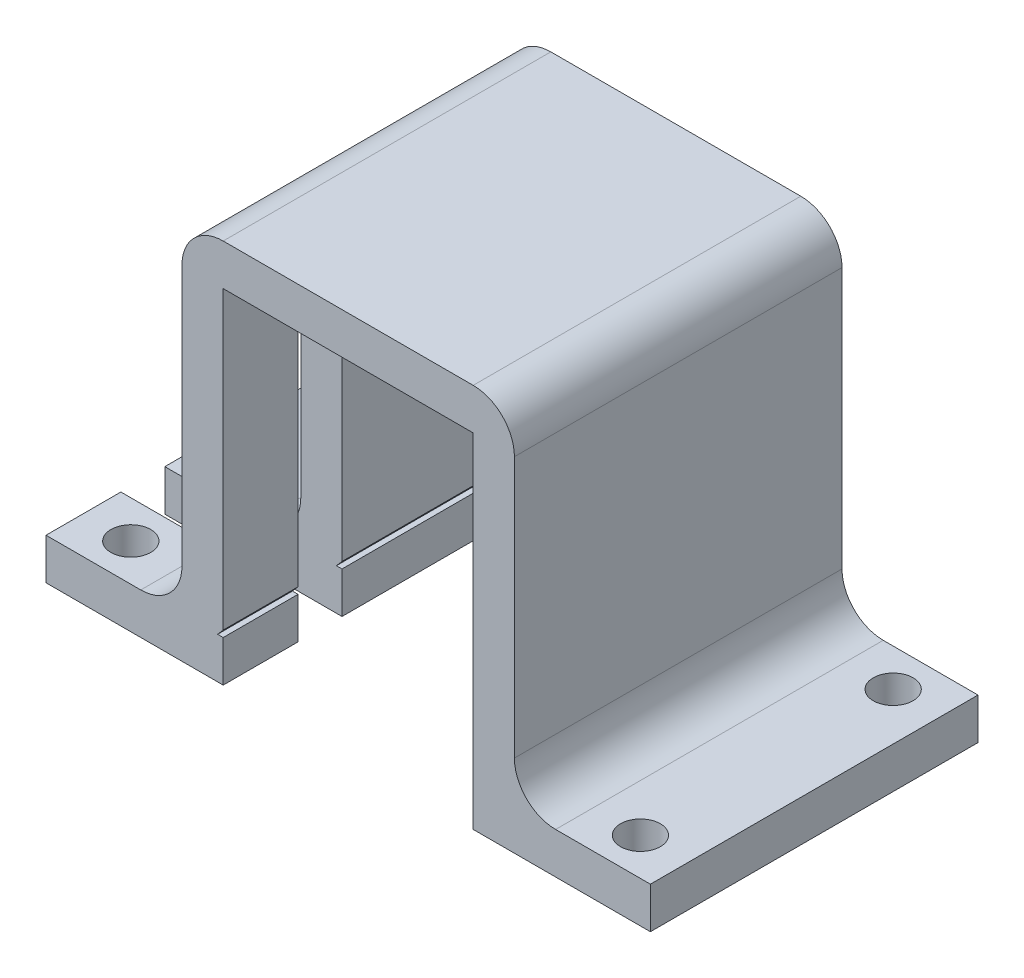
ISO-10303-21;
HEADER;
FILE_DESCRIPTION(('STEP AP214'),'2;1');
FILE_NAME('part.step','',(''),(''),'','','');
FILE_SCHEMA(('AUTOMOTIVE_DESIGN { 1 0 10303 214 1 1 1 1 }'));
ENDSEC;
DATA;
#1=APPLICATION_CONTEXT('core data for automotive mechanical design processes');
#2=APPLICATION_PROTOCOL_DEFINITION('international standard','automotive_design',2000,#1);
#3=PRODUCT_CONTEXT('',#1,'mechanical');
#4=PRODUCT('Part','Part','',(#3));
#5=PRODUCT_RELATED_PRODUCT_CATEGORY('part','',(#4));
#6=PRODUCT_DEFINITION_FORMATION('','',#4);
#7=PRODUCT_DEFINITION_CONTEXT('part definition',#1,'design');
#8=PRODUCT_DEFINITION('design','',#6,#7);
#9=PRODUCT_DEFINITION_SHAPE('','',#8);
#10=(LENGTH_UNIT() NAMED_UNIT(*) SI_UNIT(.MILLI.,.METRE.));
#11=(NAMED_UNIT(*) PLANE_ANGLE_UNIT() SI_UNIT($,.RADIAN.));
#12=(NAMED_UNIT(*) SI_UNIT($,.STERADIAN.) SOLID_ANGLE_UNIT());
#13=UNCERTAINTY_MEASURE_WITH_UNIT(LENGTH_MEASURE(1.E-05),#10,'distance_accuracy_value','');
#14=(GEOMETRIC_REPRESENTATION_CONTEXT(3) GLOBAL_UNCERTAINTY_ASSIGNED_CONTEXT((#13)) GLOBAL_UNIT_ASSIGNED_CONTEXT((#10,
#11,#12)) REPRESENTATION_CONTEXT('',''));
#15=CARTESIAN_POINT('',(0.,0.,0.));
#16=DIRECTION('',(0.,0.,1.));
#17=DIRECTION('',(1.,0.,0.));
#18=AXIS2_PLACEMENT_3D('',#15,#16,#17);
#19=CARTESIAN_POINT('',(0.,-11.,23.85));
#20=DIRECTION('',(0.,1.,0.));
#21=DIRECTION('',(-1.,0.,0.));
#22=AXIS2_PLACEMENT_3D('',#19,#20,#21);
#23=PLANE('',#22);
#24=DIRECTION('',(0.,0.,-1.));
#25=VECTOR('',#24,1.);
#26=CARTESIAN_POINT('',(-9.50714285714286,-11.,23.85));
#27=LINE('',#26,#25);
#28=CARTESIAN_POINT('',(-9.50714285714286,-11.,15.2));
#29=VERTEX_POINT('',#28);
#30=CARTESIAN_POINT('',(-9.50714285714286,-11.,0.));
#31=VERTEX_POINT('',#30);
#32=EDGE_CURVE('E369',#29,#31,#27,.T.);
#33=ORIENTED_EDGE('',*,*,#32,.F.);
#34=DIRECTION('',(1.,0.,0.));
#35=VECTOR('',#34,1.);
#36=CARTESIAN_POINT('',(0.,-11.,15.2));
#37=LINE('',#36,#35);
#38=CARTESIAN_POINT('',(-9.1,-11.,15.2));
#39=VERTEX_POINT('',#38);
#40=EDGE_CURVE('E435',#29,#39,#37,.T.);
#41=ORIENTED_EDGE('',*,*,#40,.T.);
#42=DIRECTION('',(0.,0.,-1.));
#43=VECTOR('',#42,1.);
#44=CARTESIAN_POINT('',(-9.1,-11.,23.85));
#45=LINE('',#44,#43);
#46=CARTESIAN_POINT('',(-9.1,-11.,0.));
#47=VERTEX_POINT('',#46);
#48=EDGE_CURVE('E140',#39,#47,#45,.T.);
#49=ORIENTED_EDGE('',*,*,#48,.T.);
#50=DIRECTION('',(1.,0.,0.));
#51=VECTOR('',#50,1.);
#52=CARTESIAN_POINT('',(0.,-11.,0.));
#53=LINE('',#52,#51);
#54=EDGE_CURVE('E236',#31,#47,#53,.T.);
#55=ORIENTED_EDGE('',*,*,#54,.F.);
#56=EDGE_LOOP('',(#33,#41,#49,#55));
#57=FACE_BOUND('',#56,.T.);
#58=ADVANCED_FACE('F47',(#57),#23,.T.);
#59=CARTESIAN_POINT('',(-9.1,-11.,23.85));
#60=VERTEX_POINT('',#59);
#61=CARTESIAN_POINT('',(-9.1,-11.,18.4));
#62=VERTEX_POINT('',#61);
#63=EDGE_CURVE('E72',#60,#62,#45,.T.);
#64=ORIENTED_EDGE('',*,*,#63,.T.);
#65=DIRECTION('',(-1.,0.,0.));
#66=VECTOR('',#65,1.);
#67=CARTESIAN_POINT('',(0.,-11.,18.4));
#68=LINE('',#67,#66);
#69=CARTESIAN_POINT('',(-9.50714285714286,-11.,18.4));
#70=VERTEX_POINT('',#69);
#71=EDGE_CURVE('E64',#62,#70,#68,.T.);
#72=ORIENTED_EDGE('',*,*,#71,.T.);
#73=CARTESIAN_POINT('',(-9.50714285714286,-11.,23.85));
#74=VERTEX_POINT('',#73);
#75=EDGE_CURVE('E147',#74,#70,#27,.T.);
#76=ORIENTED_EDGE('',*,*,#75,.F.);
#77=DIRECTION('',(1.,0.,0.));
#78=VECTOR('',#77,1.);
#79=CARTESIAN_POINT('',(0.,-11.,23.85));
#80=LINE('',#79,#78);
#81=EDGE_CURVE('E309',#74,#60,#80,.T.);
#82=ORIENTED_EDGE('',*,*,#81,.T.);
#83=EDGE_LOOP('',(#64,#72,#76,#82));
#84=FACE_BOUND('',#83,.T.);
#85=ADVANCED_FACE('F617',(#84),#23,.T.);
#86=CARTESIAN_POINT('',(0.,0.,23.85));
#87=DIRECTION('',(-0.756579928934907,0.65390122429374,0.));
#88=DIRECTION('',(-0.65390122429374,-0.756579928934907,0.));
#89=AXIS2_PLACEMENT_3D('',#86,#87,#88);
#90=PLANE('',#89);
#91=DIRECTION('',(0.65390122429374,0.756579928934907,0.));
#92=VECTOR('',#91,1.);
#93=CARTESIAN_POINT('',(0.,0.,15.2));
#94=LINE('',#93,#92);
#95=CARTESIAN_POINT('',(-9.1,-10.5289256198347,15.2));
#96=VERTEX_POINT('',#95);
#97=EDGE_CURVE('E438',#29,#96,#94,.T.);
#98=ORIENTED_EDGE('',*,*,#97,.F.);
#99=ORIENTED_EDGE('',*,*,#32,.T.);
#100=DIRECTION('',(0.65390122429374,0.756579928934906,0.));
#101=VECTOR('',#100,1.);
#102=CARTESIAN_POINT('',(0.,0.,0.));
#103=LINE('',#102,#101);
#104=CARTESIAN_POINT('',(-9.1,-10.5289256198347,0.));
#105=VERTEX_POINT('',#104);
#106=EDGE_CURVE('E239',#31,#105,#103,.T.);
#107=ORIENTED_EDGE('',*,*,#106,.T.);
#108=DIRECTION('',(0.,0.,-1.));
#109=VECTOR('',#108,1.);
#110=CARTESIAN_POINT('',(-9.1,-10.5289256198347,23.85));
#111=LINE('',#110,#109);
#112=EDGE_CURVE('E364',#96,#105,#111,.T.);
#113=ORIENTED_EDGE('',*,*,#112,.F.);
#114=EDGE_LOOP('',(#98,#99,#107,#113));
#115=FACE_BOUND('',#114,.T.);
#116=ADVANCED_FACE('F595',(#115),#90,.F.);
#117=DIRECTION('',(-0.65390122429374,-0.756579928934907,0.));
#118=VECTOR('',#117,1.);
#119=CARTESIAN_POINT('',(0.,0.,18.4));
#120=LINE('',#119,#118);
#121=CARTESIAN_POINT('',(-9.1,-10.5289256198347,18.4));
#122=VERTEX_POINT('',#121);
#123=EDGE_CURVE('E414',#122,#70,#120,.T.);
#124=ORIENTED_EDGE('',*,*,#123,.F.);
#125=CARTESIAN_POINT('',(-9.1,-10.5289256198347,23.85));
#126=VERTEX_POINT('',#125);
#127=EDGE_CURVE('E365',#126,#122,#111,.T.);
#128=ORIENTED_EDGE('',*,*,#127,.F.);
#129=DIRECTION('',(0.65390122429374,0.756579928934906,0.));
#130=VECTOR('',#129,1.);
#131=CARTESIAN_POINT('',(0.,0.,23.85));
#132=LINE('',#131,#130);
#133=EDGE_CURVE('E467',#74,#126,#132,.T.);
#134=ORIENTED_EDGE('',*,*,#133,.F.);
#135=ORIENTED_EDGE('',*,*,#75,.T.);
#136=EDGE_LOOP('',(#124,#128,#134,#135));
#137=FACE_BOUND('',#136,.T.);
#138=ADVANCED_FACE('F615',(#137),#90,.F.);
#139=CARTESIAN_POINT('',(-9.1,0.,23.85));
#140=DIRECTION('',(1.,0.,0.));
#141=DIRECTION('',(0.,1.,0.));
#142=AXIS2_PLACEMENT_3D('',#139,#140,#141);
#143=PLANE('',#142);
#144=DIRECTION('',(0.,0.,-1.));
#145=VECTOR('',#144,1.);
#146=CARTESIAN_POINT('',(-9.1,6.,23.85));
#147=LINE('',#146,#145);
#148=CARTESIAN_POINT('',(-9.1,6.,18.4));
#149=VERTEX_POINT('',#148);
#150=CARTESIAN_POINT('',(-9.1,6.,15.2));
#151=VERTEX_POINT('',#150);
#152=EDGE_CURVE('E240',#149,#151,#147,.T.);
#153=ORIENTED_EDGE('',*,*,#152,.T.);
#154=DIRECTION('',(0.,-1.,0.));
#155=VECTOR('',#154,1.);
#156=CARTESIAN_POINT('',(-9.1,0.,15.2));
#157=LINE('',#156,#155);
#158=EDGE_CURVE('E442',#151,#96,#157,.T.);
#159=ORIENTED_EDGE('',*,*,#158,.T.);
#160=ORIENTED_EDGE('',*,*,#112,.T.);
#161=DIRECTION('',(0.,-1.,0.));
#162=VECTOR('',#161,1.);
#163=CARTESIAN_POINT('',(-9.1,0.,0.));
#164=LINE('',#163,#162);
#165=CARTESIAN_POINT('',(-9.1,11.,0.));
#166=VERTEX_POINT('',#165);
#167=EDGE_CURVE('E244',#166,#105,#164,.T.);
#168=ORIENTED_EDGE('',*,*,#167,.F.);
#169=DIRECTION('',(0.,0.,-1.));
#170=VECTOR('',#169,1.);
#171=CARTESIAN_POINT('',(-9.1,11.,23.85));
#172=LINE('',#171,#170);
#173=CARTESIAN_POINT('',(-9.1,11.,23.85));
#174=VERTEX_POINT('',#173);
#175=EDGE_CURVE('E361',#174,#166,#172,.T.);
#176=ORIENTED_EDGE('',*,*,#175,.F.);
#177=DIRECTION('',(0.,-1.,0.));
#178=VECTOR('',#177,1.);
#179=CARTESIAN_POINT('',(-9.1,0.,23.85));
#180=LINE('',#179,#178);
#181=EDGE_CURVE('E470',#174,#126,#180,.T.);
#182=ORIENTED_EDGE('',*,*,#181,.T.);
#183=ORIENTED_EDGE('',*,*,#127,.T.);
#184=DIRECTION('',(0.,1.,0.));
#185=VECTOR('',#184,1.);
#186=CARTESIAN_POINT('',(-9.1,0.,18.4));
#187=LINE('',#186,#185);
#188=EDGE_CURVE('E417',#122,#149,#187,.T.);
#189=ORIENTED_EDGE('',*,*,#188,.T.);
#190=EDGE_LOOP('',(#153,#159,#160,#168,#176,#182,#183,#189));
#191=FACE_BOUND('',#190,.T.);
#192=ADVANCED_FACE('F594',(#191),#143,.T.);
#193=CARTESIAN_POINT('',(-12.1,0.,23.85));
#194=DIRECTION('',(1.,0.,0.));
#195=DIRECTION('',(0.,0.,-1.));
#196=AXIS2_PLACEMENT_3D('',#193,#194,#195);
#197=PLANE('',#196);
#198=DIRECTION('',(0.,-1.,0.));
#199=VECTOR('',#198,1.);
#200=CARTESIAN_POINT('',(-12.1,0.,15.2));
#201=LINE('',#200,#199);
#202=CARTESIAN_POINT('',(-12.1,6.,15.2));
#203=VERTEX_POINT('',#202);
#204=CARTESIAN_POINT('',(-12.1,-8.,15.2));
#205=VERTEX_POINT('',#204);
#206=EDGE_CURVE('E458',#203,#205,#201,.T.);
#207=ORIENTED_EDGE('',*,*,#206,.F.);
#208=DIRECTION('',(0.,0.,-1.));
#209=VECTOR('',#208,1.);
#210=CARTESIAN_POINT('',(-12.1,6.,23.85));
#211=LINE('',#210,#209);
#212=CARTESIAN_POINT('',(-12.1,6.,18.4));
#213=VERTEX_POINT('',#212);
#214=EDGE_CURVE('E11',#213,#203,#211,.T.);
#215=ORIENTED_EDGE('',*,*,#214,.F.);
#216=DIRECTION('',(0.,1.,0.));
#217=VECTOR('',#216,1.);
#218=CARTESIAN_POINT('',(-12.1,0.,18.4));
#219=LINE('',#218,#217);
#220=CARTESIAN_POINT('',(-12.1,-7.99999999999998,18.4));
#221=VERTEX_POINT('',#220);
#222=EDGE_CURVE('E431',#221,#213,#219,.T.);
#223=ORIENTED_EDGE('',*,*,#222,.F.);
#224=DIRECTION('',(0.,0.,-1.));
#225=VECTOR('',#224,1.);
#226=CARTESIAN_POINT('',(-12.1,-7.99999999999998,23.85));
#227=LINE('',#226,#225);
#228=CARTESIAN_POINT('',(-12.1,-7.99999999999998,23.85));
#229=VERTEX_POINT('',#228);
#230=EDGE_CURVE('E324',#229,#221,#227,.T.);
#231=ORIENTED_EDGE('',*,*,#230,.F.);
#232=DIRECTION('',(0.,-1.,0.));
#233=VECTOR('',#232,1.);
#234=CARTESIAN_POINT('',(-12.1,0.,23.85));
#235=LINE('',#234,#233);
#236=CARTESIAN_POINT('',(-12.1,11.,23.85));
#237=VERTEX_POINT('',#236);
#238=EDGE_CURVE('E510',#237,#229,#235,.T.);
#239=ORIENTED_EDGE('',*,*,#238,.F.);
#240=DIRECTION('',(0.,0.,-1.));
#241=VECTOR('',#240,1.);
#242=CARTESIAN_POINT('',(-12.1,11.,23.85));
#243=LINE('',#242,#241);
#244=CARTESIAN_POINT('',(-12.1,11.,0.));
#245=VERTEX_POINT('',#244);
#246=EDGE_CURVE('E328',#237,#245,#243,.T.);
#247=ORIENTED_EDGE('',*,*,#246,.T.);
#248=DIRECTION('',(0.,-1.,0.));
#249=VECTOR('',#248,1.);
#250=CARTESIAN_POINT('',(-12.1,0.,0.));
#251=LINE('',#250,#249);
#252=CARTESIAN_POINT('',(-12.1,-7.99999999999998,0.));
#253=VERTEX_POINT('',#252);
#254=EDGE_CURVE('E285',#245,#253,#251,.T.);
#255=ORIENTED_EDGE('',*,*,#254,.T.);
#256=EDGE_CURVE('E323',#205,#253,#227,.T.);
#257=ORIENTED_EDGE('',*,*,#256,.F.);
#258=EDGE_LOOP('',(#207,#215,#223,#231,#239,#247,#255,#257));
#259=FACE_BOUND('',#258,.T.);
#260=ADVANCED_FACE('F564',(#259),#197,.F.);
#261=CARTESIAN_POINT('',(-15.1,-8.,23.85));
#262=DIRECTION('',(0.,0.,-1.));
#263=DIRECTION('',(-1.,0.,0.));
#264=AXIS2_PLACEMENT_3D('',#261,#262,#263);
#265=CYLINDRICAL_SURFACE('',#264,3.);
#266=CARTESIAN_POINT('',(-15.1,-8.,15.2));
#267=DIRECTION('',(0.,0.,1.));
#268=DIRECTION('',(1.,0.,0.));
#269=AXIS2_PLACEMENT_3D('',#266,#267,#268);
#270=CIRCLE('',#269,3.);
#271=CARTESIAN_POINT('',(-15.1,-11.,15.2));
#272=VERTEX_POINT('',#271);
#273=EDGE_CURVE('E454',#205,#272,#270,.F.);
#274=ORIENTED_EDGE('',*,*,#273,.F.);
#275=ORIENTED_EDGE('',*,*,#256,.T.);
#276=CARTESIAN_POINT('',(-15.1,-8.,0.));
#277=DIRECTION('',(0.,0.,1.));
#278=DIRECTION('',(1.,0.,0.));
#279=AXIS2_PLACEMENT_3D('',#276,#277,#278);
#280=CIRCLE('',#279,3.);
#281=CARTESIAN_POINT('',(-15.1,-11.,0.));
#282=VERTEX_POINT('',#281);
#283=EDGE_CURVE('E289',#253,#282,#280,.F.);
#284=ORIENTED_EDGE('',*,*,#283,.T.);
#285=DIRECTION('',(0.,0.,-1.));
#286=VECTOR('',#285,1.);
#287=CARTESIAN_POINT('',(-15.1,-11.,23.85));
#288=LINE('',#287,#286);
#289=EDGE_CURVE('E318',#272,#282,#288,.T.);
#290=ORIENTED_EDGE('',*,*,#289,.F.);
#291=EDGE_LOOP('',(#274,#275,#284,#290));
#292=FACE_BOUND('',#291,.T.);
#293=ADVANCED_FACE('F563',(#292),#265,.F.);
#294=CARTESIAN_POINT('',(-15.1,-8.,18.4));
#295=DIRECTION('',(0.,0.,-1.));
#296=DIRECTION('',(0.,1.,0.));
#297=AXIS2_PLACEMENT_3D('',#294,#295,#296);
#298=CIRCLE('',#297,3.);
#299=CARTESIAN_POINT('',(-15.1,-11.,18.4));
#300=VERTEX_POINT('',#299);
#301=EDGE_CURVE('E427',#300,#221,#298,.F.);
#302=ORIENTED_EDGE('',*,*,#301,.F.);
#303=CARTESIAN_POINT('',(-15.1,-11.,23.85));
#304=VERTEX_POINT('',#303);
#305=EDGE_CURVE('E319',#304,#300,#288,.T.);
#306=ORIENTED_EDGE('',*,*,#305,.F.);
#307=CARTESIAN_POINT('',(-15.1,-8.,23.85));
#308=DIRECTION('',(0.,0.,1.));
#309=DIRECTION('',(1.,0.,0.));
#310=AXIS2_PLACEMENT_3D('',#307,#308,#309);
#311=CIRCLE('',#310,3.);
#312=EDGE_CURVE('E513',#229,#304,#311,.F.);
#313=ORIENTED_EDGE('',*,*,#312,.F.);
#314=ORIENTED_EDGE('',*,*,#230,.T.);
#315=EDGE_LOOP('',(#302,#306,#313,#314));
#316=FACE_BOUND('',#315,.T.);
#317=ADVANCED_FACE('F635',(#316),#265,.F.);
#318=CARTESIAN_POINT('',(0.,-11.,23.85));
#319=DIRECTION('',(0.,1.,0.));
#320=DIRECTION('',(-1.,0.,0.));
#321=AXIS2_PLACEMENT_3D('',#318,#319,#320);
#322=PLANE('',#321);
#323=CARTESIAN_POINT('',(-18.55,-11.,2.72499999999999));
#324=DIRECTION('',(0.,1.,0.));
#325=DIRECTION('',(1.,0.,0.));
#326=AXIS2_PLACEMENT_3D('',#323,#324,#325);
#327=CIRCLE('',#326,1.45);
#328=CARTESIAN_POINT('',(-17.1,-11.,2.72499999999999));
#329=VERTEX_POINT('',#328);
#330=EDGE_CURVE('E717',#329,#329,#327,.T.);
#331=ORIENTED_EDGE('',*,*,#330,.F.);
#332=EDGE_LOOP('',(#331));
#333=FACE_BOUND('',#332,.T.);
#334=DIRECTION('',(0.,0.,-1.));
#335=VECTOR('',#334,1.);
#336=CARTESIAN_POINT('',(-22.,-11.,23.85));
#337=LINE('',#336,#335);
#338=CARTESIAN_POINT('',(-22.,-11.,15.2));
#339=VERTEX_POINT('',#338);
#340=CARTESIAN_POINT('',(-22.,-11.,0.));
#341=VERTEX_POINT('',#340);
#342=EDGE_CURVE('E223',#339,#341,#337,.T.);
#343=ORIENTED_EDGE('',*,*,#342,.F.);
#344=DIRECTION('',(1.,0.,0.));
#345=VECTOR('',#344,1.);
#346=CARTESIAN_POINT('',(0.,-11.,15.2));
#347=LINE('',#346,#345);
#348=EDGE_CURVE('E450',#339,#272,#347,.T.);
#349=ORIENTED_EDGE('',*,*,#348,.T.);
#350=ORIENTED_EDGE('',*,*,#289,.T.);
#351=DIRECTION('',(1.,0.,0.));
#352=VECTOR('',#351,1.);
#353=CARTESIAN_POINT('',(0.,-11.,0.));
#354=LINE('',#353,#352);
#355=EDGE_CURVE('E293',#341,#282,#354,.T.);
#356=ORIENTED_EDGE('',*,*,#355,.F.);
#357=EDGE_LOOP('',(#343,#349,#350,#356));
#358=FACE_BOUND('',#357,.T.);
#359=ADVANCED_FACE('F645',(#333,#358),#322,.T.);
#360=CARTESIAN_POINT('',(-18.55,-11.,21.125));
#361=DIRECTION('',(0.,1.,0.));
#362=DIRECTION('',(-1.,0.,0.));
#363=AXIS2_PLACEMENT_3D('',#360,#361,#362);
#364=CIRCLE('',#363,1.45);
#365=CARTESIAN_POINT('',(-20.,-11.,21.125));
#366=VERTEX_POINT('',#365);
#367=EDGE_CURVE('E394',#366,#366,#364,.T.);
#368=ORIENTED_EDGE('',*,*,#367,.F.);
#369=EDGE_LOOP('',(#368));
#370=FACE_BOUND('',#369,.T.);
#371=ORIENTED_EDGE('',*,*,#305,.T.);
#372=DIRECTION('',(-1.,0.,0.));
#373=VECTOR('',#372,1.);
#374=CARTESIAN_POINT('',(0.,-11.,18.4));
#375=LINE('',#374,#373);
#376=CARTESIAN_POINT('',(-22.,-11.,18.4));
#377=VERTEX_POINT('',#376);
#378=EDGE_CURVE('E423',#300,#377,#375,.T.);
#379=ORIENTED_EDGE('',*,*,#378,.T.);
#380=CARTESIAN_POINT('',(-22.,-11.,23.85));
#381=VERTEX_POINT('',#380);
#382=EDGE_CURVE('E315',#381,#377,#337,.T.);
#383=ORIENTED_EDGE('',*,*,#382,.F.);
#384=DIRECTION('',(1.,0.,0.));
#385=VECTOR('',#384,1.);
#386=CARTESIAN_POINT('',(0.,-11.,23.85));
#387=LINE('',#386,#385);
#388=EDGE_CURVE('E208',#381,#304,#387,.T.);
#389=ORIENTED_EDGE('',*,*,#388,.T.);
#390=EDGE_LOOP('',(#371,#379,#383,#389));
#391=FACE_BOUND('',#390,.T.);
#392=ADVANCED_FACE('F517',(#370,#391),#322,.T.);
#393=CARTESIAN_POINT('',(-22.,0.,23.85));
#394=DIRECTION('',(1.,0.,0.));
#395=DIRECTION('',(0.,0.,-1.));
#396=AXIS2_PLACEMENT_3D('',#393,#394,#395);
#397=PLANE('',#396);
#398=DIRECTION('',(0.,-1.,0.));
#399=VECTOR('',#398,1.);
#400=CARTESIAN_POINT('',(-22.,0.,15.2));
#401=LINE('',#400,#399);
#402=CARTESIAN_POINT('',(-22.,-14.,15.2));
#403=VERTEX_POINT('',#402);
#404=EDGE_CURVE('E446',#339,#403,#401,.T.);
#405=ORIENTED_EDGE('',*,*,#404,.F.);
#406=ORIENTED_EDGE('',*,*,#342,.T.);
#407=DIRECTION('',(0.,-1.,0.));
#408=VECTOR('',#407,1.);
#409=CARTESIAN_POINT('',(-22.,0.,0.));
#410=LINE('',#409,#408);
#411=CARTESIAN_POINT('',(-22.,-14.,0.));
#412=VERTEX_POINT('',#411);
#413=EDGE_CURVE('E297',#341,#412,#410,.T.);
#414=ORIENTED_EDGE('',*,*,#413,.T.);
#415=DIRECTION('',(0.,0.,-1.));
#416=VECTOR('',#415,1.);
#417=CARTESIAN_POINT('',(-22.,-14.,23.85));
#418=LINE('',#417,#416);
#419=EDGE_CURVE('E224',#403,#412,#418,.T.);
#420=ORIENTED_EDGE('',*,*,#419,.F.);
#421=EDGE_LOOP('',(#405,#406,#414,#420));
#422=FACE_BOUND('',#421,.T.);
#423=ADVANCED_FACE('F648',(#422),#397,.F.);
#424=DIRECTION('',(0.,1.,0.));
#425=VECTOR('',#424,1.);
#426=CARTESIAN_POINT('',(-22.,0.,18.4));
#427=LINE('',#426,#425);
#428=CARTESIAN_POINT('',(-22.,-14.,18.4));
#429=VERTEX_POINT('',#428);
#430=EDGE_CURVE('E219',#429,#377,#427,.T.);
#431=ORIENTED_EDGE('',*,*,#430,.F.);
#432=CARTESIAN_POINT('',(-22.,-14.,23.85));
#433=VERTEX_POINT('',#432);
#434=EDGE_CURVE('E215',#433,#429,#418,.T.);
#435=ORIENTED_EDGE('',*,*,#434,.F.);
#436=DIRECTION('',(0.,-1.,0.));
#437=VECTOR('',#436,1.);
#438=CARTESIAN_POINT('',(-22.,0.,23.85));
#439=LINE('',#438,#437);
#440=EDGE_CURVE('E199',#381,#433,#439,.T.);
#441=ORIENTED_EDGE('',*,*,#440,.F.);
#442=ORIENTED_EDGE('',*,*,#382,.T.);
#443=EDGE_LOOP('',(#431,#435,#441,#442));
#444=FACE_BOUND('',#443,.T.);
#445=ADVANCED_FACE('F216',(#444),#397,.F.);
#446=CARTESIAN_POINT('',(0.,-14.,23.85));
#447=DIRECTION('',(0.,1.,0.));
#448=DIRECTION('',(-1.,0.,0.));
#449=AXIS2_PLACEMENT_3D('',#446,#447,#448);
#450=PLANE('',#449);
#451=CARTESIAN_POINT('',(-18.55,-14.,2.72499999999999));
#452=DIRECTION('',(0.,1.,0.));
#453=DIRECTION('',(-1.,0.,0.));
#454=AXIS2_PLACEMENT_3D('',#451,#452,#453);
#455=CIRCLE('',#454,1.45);
#456=CARTESIAN_POINT('',(-20.,-14.,2.72499999999999));
#457=VERTEX_POINT('',#456);
#458=EDGE_CURVE('E50',#457,#457,#455,.T.);
#459=ORIENTED_EDGE('',*,*,#458,.T.);
#460=EDGE_LOOP('',(#459));
#461=FACE_BOUND('',#460,.T.);
#462=DIRECTION('',(1.,0.,0.));
#463=VECTOR('',#462,1.);
#464=CARTESIAN_POINT('',(-24.1,-14.,15.2));
#465=LINE('',#464,#463);
#466=CARTESIAN_POINT('',(-9.1,-14.,15.2));
#467=VERTEX_POINT('',#466);
#468=EDGE_CURVE('E408',#403,#467,#465,.T.);
#469=ORIENTED_EDGE('',*,*,#468,.F.);
#470=ORIENTED_EDGE('',*,*,#419,.T.);
#471=DIRECTION('',(1.,0.,0.));
#472=VECTOR('',#471,1.);
#473=CARTESIAN_POINT('',(0.,-14.,0.));
#474=LINE('',#473,#472);
#475=CARTESIAN_POINT('',(-9.1,-14.,0.));
#476=VERTEX_POINT('',#475);
#477=EDGE_CURVE('E301',#412,#476,#474,.T.);
#478=ORIENTED_EDGE('',*,*,#477,.T.);
#479=DIRECTION('',(0.,0.,-1.));
#480=VECTOR('',#479,1.);
#481=CARTESIAN_POINT('',(-9.1,-14.,23.85));
#482=LINE('',#481,#480);
#483=EDGE_CURVE('E312',#467,#476,#482,.T.);
#484=ORIENTED_EDGE('',*,*,#483,.F.);
#485=EDGE_LOOP('',(#469,#470,#478,#484));
#486=FACE_BOUND('',#485,.T.);
#487=ADVANCED_FACE('F580',(#461,#486),#450,.F.);
#488=CARTESIAN_POINT('',(-18.55,-14.,21.125));
#489=DIRECTION('',(0.,1.,0.));
#490=DIRECTION('',(-1.,0.,0.));
#491=AXIS2_PLACEMENT_3D('',#488,#489,#490);
#492=CIRCLE('',#491,1.45);
#493=CARTESIAN_POINT('',(-20.,-14.,21.125));
#494=VERTEX_POINT('',#493);
#495=EDGE_CURVE('E377',#494,#494,#492,.T.);
#496=ORIENTED_EDGE('',*,*,#495,.T.);
#497=EDGE_LOOP('',(#496));
#498=FACE_BOUND('',#497,.T.);
#499=DIRECTION('',(1.,0.,0.));
#500=VECTOR('',#499,1.);
#501=CARTESIAN_POINT('',(-24.1,-14.,18.4));
#502=LINE('',#501,#500);
#503=CARTESIAN_POINT('',(-9.1,-14.,18.4));
#504=VERTEX_POINT('',#503);
#505=EDGE_CURVE('E405',#429,#504,#502,.T.);
#506=ORIENTED_EDGE('',*,*,#505,.T.);
#507=CARTESIAN_POINT('',(-9.1,-14.,23.85));
#508=VERTEX_POINT('',#507);
#509=EDGE_CURVE('E228',#508,#504,#482,.T.);
#510=ORIENTED_EDGE('',*,*,#509,.F.);
#511=DIRECTION('',(1.,0.,0.));
#512=VECTOR('',#511,1.);
#513=CARTESIAN_POINT('',(0.,-14.,23.85));
#514=LINE('',#513,#512);
#515=EDGE_CURVE('E205',#433,#508,#514,.T.);
#516=ORIENTED_EDGE('',*,*,#515,.F.);
#517=ORIENTED_EDGE('',*,*,#434,.T.);
#518=EDGE_LOOP('',(#506,#510,#516,#517));
#519=FACE_BOUND('',#518,.T.);
#520=ADVANCED_FACE('F226',(#498,#519),#450,.F.);
#521=CARTESIAN_POINT('',(-9.1,0.,23.85));
#522=DIRECTION('',(1.,0.,0.));
#523=DIRECTION('',(0.,0.,-1.));
#524=AXIS2_PLACEMENT_3D('',#521,#522,#523);
#525=PLANE('',#524);
#526=ORIENTED_EDGE('',*,*,#48,.F.);
#527=DIRECTION('',(0.,-1.,0.));
#528=VECTOR('',#527,1.);
#529=CARTESIAN_POINT('',(-9.1,0.,15.2));
#530=LINE('',#529,#528);
#531=EDGE_CURVE('E56',#39,#467,#530,.T.);
#532=ORIENTED_EDGE('',*,*,#531,.T.);
#533=ORIENTED_EDGE('',*,*,#483,.T.);
#534=DIRECTION('',(0.,-1.,0.));
#535=VECTOR('',#534,1.);
#536=CARTESIAN_POINT('',(-9.1,0.,0.));
#537=LINE('',#536,#535);
#538=EDGE_CURVE('E305',#47,#476,#537,.T.);
#539=ORIENTED_EDGE('',*,*,#538,.F.);
#540=EDGE_LOOP('',(#526,#532,#533,#539));
#541=FACE_BOUND('',#540,.T.);
#542=ADVANCED_FACE('F576',(#541),#525,.T.);
#543=ORIENTED_EDGE('',*,*,#509,.T.);
#544=DIRECTION('',(0.,1.,0.));
#545=VECTOR('',#544,1.);
#546=CARTESIAN_POINT('',(-9.1,0.,18.4));
#547=LINE('',#546,#545);
#548=EDGE_CURVE('E372',#504,#62,#547,.T.);
#549=ORIENTED_EDGE('',*,*,#548,.T.);
#550=ORIENTED_EDGE('',*,*,#63,.F.);
#551=DIRECTION('',(0.,-1.,0.));
#552=VECTOR('',#551,1.);
#553=CARTESIAN_POINT('',(-9.1,0.,23.85));
#554=LINE('',#553,#552);
#555=EDGE_CURVE('E230',#60,#508,#554,.T.);
#556=ORIENTED_EDGE('',*,*,#555,.T.);
#557=EDGE_LOOP('',(#543,#549,#550,#556));
#558=FACE_BOUND('',#557,.T.);
#559=ADVANCED_FACE('F618',(#558),#525,.T.);
#560=CARTESIAN_POINT('',(0.,11.,23.85));
#561=DIRECTION('',(0.,1.,0.));
#562=DIRECTION('',(0.,0.,1.));
#563=AXIS2_PLACEMENT_3D('',#560,#561,#562);
#564=PLANE('',#563);
#565=DIRECTION('',(1.,0.,0.));
#566=VECTOR('',#565,1.);
#567=CARTESIAN_POINT('',(0.,11.,0.));
#568=LINE('',#567,#566);
#569=CARTESIAN_POINT('',(9.1,11.,0.));
#570=VERTEX_POINT('',#569);
#571=EDGE_CURVE('E248',#166,#570,#568,.T.);
#572=ORIENTED_EDGE('',*,*,#571,.T.);
#573=DIRECTION('',(0.,0.,-1.));
#574=VECTOR('',#573,1.);
#575=CARTESIAN_POINT('',(9.1,11.,23.85));
#576=LINE('',#575,#574);
#577=CARTESIAN_POINT('',(9.1,11.,23.85));
#578=VERTEX_POINT('',#577);
#579=EDGE_CURVE('E357',#578,#570,#576,.T.);
#580=ORIENTED_EDGE('',*,*,#579,.F.);
#581=DIRECTION('',(1.,0.,0.));
#582=VECTOR('',#581,1.);
#583=CARTESIAN_POINT('',(0.,11.,23.85));
#584=LINE('',#583,#582);
#585=EDGE_CURVE('E474',#174,#578,#584,.T.);
#586=ORIENTED_EDGE('',*,*,#585,.F.);
#587=ORIENTED_EDGE('',*,*,#175,.T.);
#588=EDGE_LOOP('',(#572,#580,#586,#587));
#589=FACE_BOUND('',#588,.T.);
#590=ADVANCED_FACE('F601',(#589),#564,.F.);
#591=CARTESIAN_POINT('',(9.1,0.,23.85));
#592=DIRECTION('',(1.,0.,0.));
#593=DIRECTION('',(0.,0.,-1.));
#594=AXIS2_PLACEMENT_3D('',#591,#592,#593);
#595=PLANE('',#594);
#596=DIRECTION('',(0.,-1.,0.));
#597=VECTOR('',#596,1.);
#598=CARTESIAN_POINT('',(9.1,0.,0.));
#599=LINE('',#598,#597);
#600=CARTESIAN_POINT('',(9.1,-14.,0.));
#601=VERTEX_POINT('',#600);
#602=EDGE_CURVE('E251',#570,#601,#599,.T.);
#603=ORIENTED_EDGE('',*,*,#602,.T.);
#604=DIRECTION('',(0.,0.,-1.));
#605=VECTOR('',#604,1.);
#606=CARTESIAN_POINT('',(9.1,-14.,23.85));
#607=LINE('',#606,#605);
#608=CARTESIAN_POINT('',(9.1,-14.,23.85));
#609=VERTEX_POINT('',#608);
#610=EDGE_CURVE('E353',#609,#601,#607,.T.);
#611=ORIENTED_EDGE('',*,*,#610,.F.);
#612=DIRECTION('',(0.,-1.,0.));
#613=VECTOR('',#612,1.);
#614=CARTESIAN_POINT('',(9.1,0.,23.85));
#615=LINE('',#614,#613);
#616=EDGE_CURVE('E477',#578,#609,#615,.T.);
#617=ORIENTED_EDGE('',*,*,#616,.F.);
#618=ORIENTED_EDGE('',*,*,#579,.T.);
#619=EDGE_LOOP('',(#603,#611,#617,#618));
#620=FACE_BOUND('',#619,.T.);
#621=ADVANCED_FACE('F605',(#620),#595,.F.);
#622=CARTESIAN_POINT('',(0.,-14.,23.85));
#623=DIRECTION('',(0.,1.,0.));
#624=DIRECTION('',(0.,0.,1.));
#625=AXIS2_PLACEMENT_3D('',#622,#623,#624);
#626=PLANE('',#625);
#627=CARTESIAN_POINT('',(18.55,-14.,21.125));
#628=DIRECTION('',(0.,1.,0.));
#629=DIRECTION('',(0.,0.,1.));
#630=AXIS2_PLACEMENT_3D('',#627,#628,#629);
#631=CIRCLE('',#630,1.45);
#632=CARTESIAN_POINT('',(18.55,-14.,22.575));
#633=VERTEX_POINT('',#632);
#634=EDGE_CURVE('E380',#633,#633,#631,.T.);
#635=ORIENTED_EDGE('',*,*,#634,.T.);
#636=EDGE_LOOP('',(#635));
#637=FACE_BOUND('',#636,.T.);
#638=CARTESIAN_POINT('',(18.55,-14.,2.72499999999999));
#639=DIRECTION('',(0.,1.,0.));
#640=DIRECTION('',(0.,0.,1.));
#641=AXIS2_PLACEMENT_3D('',#638,#639,#640);
#642=CIRCLE('',#641,1.45);
#643=CARTESIAN_POINT('',(18.55,-14.,4.17499999999999));
#644=VERTEX_POINT('',#643);
#645=EDGE_CURVE('E388',#644,#644,#642,.T.);
#646=ORIENTED_EDGE('',*,*,#645,.T.);
#647=EDGE_LOOP('',(#646));
#648=FACE_BOUND('',#647,.T.);
#649=DIRECTION('',(1.,0.,0.));
#650=VECTOR('',#649,1.);
#651=CARTESIAN_POINT('',(0.,-14.,0.));
#652=LINE('',#651,#650);
#653=CARTESIAN_POINT('',(22.,-14.,0.));
#654=VERTEX_POINT('',#653);
#655=EDGE_CURVE('E254',#601,#654,#652,.T.);
#656=ORIENTED_EDGE('',*,*,#655,.T.);
#657=DIRECTION('',(0.,0.,-1.));
#658=VECTOR('',#657,1.);
#659=CARTESIAN_POINT('',(22.,-14.,23.85));
#660=LINE('',#659,#658);
#661=CARTESIAN_POINT('',(22.,-14.,23.85));
#662=VERTEX_POINT('',#661);
#663=EDGE_CURVE('E350',#662,#654,#660,.T.);
#664=ORIENTED_EDGE('',*,*,#663,.F.);
#665=DIRECTION('',(1.,0.,0.));
#666=VECTOR('',#665,1.);
#667=CARTESIAN_POINT('',(0.,-14.,23.85));
#668=LINE('',#667,#666);
#669=EDGE_CURVE('E480',#609,#662,#668,.T.);
#670=ORIENTED_EDGE('',*,*,#669,.F.);
#671=ORIENTED_EDGE('',*,*,#610,.T.);
#672=EDGE_LOOP('',(#656,#664,#670,#671));
#673=FACE_BOUND('',#672,.T.);
#674=ADVANCED_FACE('F677',(#637,#648,#673),#626,.F.);
#675=CARTESIAN_POINT('',(22.,0.,23.85));
#676=DIRECTION('',(1.,0.,0.));
#677=DIRECTION('',(0.,1.,0.));
#678=AXIS2_PLACEMENT_3D('',#675,#676,#677);
#679=PLANE('',#678);
#680=DIRECTION('',(0.,-1.,0.));
#681=VECTOR('',#680,1.);
#682=CARTESIAN_POINT('',(22.,0.,0.));
#683=LINE('',#682,#681);
#684=CARTESIAN_POINT('',(22.,-11.,0.));
#685=VERTEX_POINT('',#684);
#686=EDGE_CURVE('E258',#685,#654,#683,.T.);
#687=ORIENTED_EDGE('',*,*,#686,.F.);
#688=DIRECTION('',(0.,0.,-1.));
#689=VECTOR('',#688,1.);
#690=CARTESIAN_POINT('',(22.,-11.,23.85));
#691=LINE('',#690,#689);
#692=CARTESIAN_POINT('',(22.,-11.,23.85));
#693=VERTEX_POINT('',#692);
#694=EDGE_CURVE('E347',#693,#685,#691,.T.);
#695=ORIENTED_EDGE('',*,*,#694,.F.);
#696=DIRECTION('',(0.,-1.,0.));
#697=VECTOR('',#696,1.);
#698=CARTESIAN_POINT('',(22.,0.,23.85));
#699=LINE('',#698,#697);
#700=EDGE_CURVE('E483',#693,#662,#699,.T.);
#701=ORIENTED_EDGE('',*,*,#700,.T.);
#702=ORIENTED_EDGE('',*,*,#663,.T.);
#703=EDGE_LOOP('',(#687,#695,#701,#702));
#704=FACE_BOUND('',#703,.T.);
#705=ADVANCED_FACE('F680',(#704),#679,.T.);
#706=CARTESIAN_POINT('',(0.,-11.,23.85));
#707=DIRECTION('',(0.,1.,0.));
#708=DIRECTION('',(-1.,0.,0.));
#709=AXIS2_PLACEMENT_3D('',#706,#707,#708);
#710=PLANE('',#709);
#711=CARTESIAN_POINT('',(18.55,-11.,21.125));
#712=DIRECTION('',(0.,1.,0.));
#713=DIRECTION('',(1.,0.,0.));
#714=AXIS2_PLACEMENT_3D('',#711,#712,#713);
#715=CIRCLE('',#714,1.45);
#716=CARTESIAN_POINT('',(20.,-11.,21.125));
#717=VERTEX_POINT('',#716);
#718=EDGE_CURVE('E720',#717,#717,#715,.T.);
#719=ORIENTED_EDGE('',*,*,#718,.F.);
#720=EDGE_LOOP('',(#719));
#721=FACE_BOUND('',#720,.T.);
#722=CARTESIAN_POINT('',(18.55,-11.,2.72499999999999));
#723=DIRECTION('',(0.,1.,0.));
#724=DIRECTION('',(-1.,0.,0.));
#725=AXIS2_PLACEMENT_3D('',#722,#723,#724);
#726=CIRCLE('',#725,1.45);
#727=CARTESIAN_POINT('',(17.1,-11.,2.72499999999999));
#728=VERTEX_POINT('',#727);
#729=EDGE_CURVE('E726',#728,#728,#726,.T.);
#730=ORIENTED_EDGE('',*,*,#729,.F.);
#731=EDGE_LOOP('',(#730));
#732=FACE_BOUND('',#731,.T.);
#733=DIRECTION('',(1.,0.,0.));
#734=VECTOR('',#733,1.);
#735=CARTESIAN_POINT('',(0.,-11.,0.));
#736=LINE('',#735,#734);
#737=CARTESIAN_POINT('',(15.1,-11.,0.));
#738=VERTEX_POINT('',#737);
#739=EDGE_CURVE('E262',#738,#685,#736,.T.);
#740=ORIENTED_EDGE('',*,*,#739,.F.);
#741=DIRECTION('',(0.,0.,-1.));
#742=VECTOR('',#741,1.);
#743=CARTESIAN_POINT('',(15.1,-11.,23.85));
#744=LINE('',#743,#742);
#745=CARTESIAN_POINT('',(15.1,-11.,23.85));
#746=VERTEX_POINT('',#745);
#747=EDGE_CURVE('E344',#746,#738,#744,.T.);
#748=ORIENTED_EDGE('',*,*,#747,.F.);
#749=DIRECTION('',(1.,0.,0.));
#750=VECTOR('',#749,1.);
#751=CARTESIAN_POINT('',(0.,-11.,23.85));
#752=LINE('',#751,#750);
#753=EDGE_CURVE('E487',#746,#693,#752,.T.);
#754=ORIENTED_EDGE('',*,*,#753,.T.);
#755=ORIENTED_EDGE('',*,*,#694,.T.);
#756=EDGE_LOOP('',(#740,#748,#754,#755));
#757=FACE_BOUND('',#756,.T.);
#758=ADVANCED_FACE('F683',(#721,#732,#757),#710,.T.);
#759=CARTESIAN_POINT('',(15.1,-8.,23.85));
#760=DIRECTION('',(0.,0.,-1.));
#761=DIRECTION('',(-1.,0.,0.));
#762=AXIS2_PLACEMENT_3D('',#759,#760,#761);
#763=CYLINDRICAL_SURFACE('',#762,3.);
#764=CARTESIAN_POINT('',(15.1,-8.,0.));
#765=DIRECTION('',(0.,0.,1.));
#766=DIRECTION('',(1.,0.,0.));
#767=AXIS2_PLACEMENT_3D('',#764,#765,#766);
#768=CIRCLE('',#767,3.);
#769=CARTESIAN_POINT('',(12.1,-7.99999999999998,0.));
#770=VERTEX_POINT('',#769);
#771=EDGE_CURVE('E266',#770,#738,#768,.T.);
#772=ORIENTED_EDGE('',*,*,#771,.F.);
#773=DIRECTION('',(0.,0.,-1.));
#774=VECTOR('',#773,1.);
#775=CARTESIAN_POINT('',(12.1,-7.99999999999998,23.85));
#776=LINE('',#775,#774);
#777=CARTESIAN_POINT('',(12.1,-7.99999999999998,23.85));
#778=VERTEX_POINT('',#777);
#779=EDGE_CURVE('E341',#778,#770,#776,.T.);
#780=ORIENTED_EDGE('',*,*,#779,.F.);
#781=CARTESIAN_POINT('',(15.1,-8.,23.85));
#782=DIRECTION('',(0.,0.,1.));
#783=DIRECTION('',(1.,0.,0.));
#784=AXIS2_PLACEMENT_3D('',#781,#782,#783);
#785=CIRCLE('',#784,3.);
#786=EDGE_CURVE('E491',#778,#746,#785,.T.);
#787=ORIENTED_EDGE('',*,*,#786,.T.);
#788=ORIENTED_EDGE('',*,*,#747,.T.);
#789=EDGE_LOOP('',(#772,#780,#787,#788));
#790=FACE_BOUND('',#789,.T.);
#791=ADVANCED_FACE('F687',(#790),#763,.F.);
#792=CARTESIAN_POINT('',(12.1,0.,23.85));
#793=DIRECTION('',(1.,0.,0.));
#794=DIRECTION('',(0.,1.,0.));
#795=AXIS2_PLACEMENT_3D('',#792,#793,#794);
#796=PLANE('',#795);
#797=DIRECTION('',(0.,-1.,0.));
#798=VECTOR('',#797,1.);
#799=CARTESIAN_POINT('',(12.1,0.,0.));
#800=LINE('',#799,#798);
#801=CARTESIAN_POINT('',(12.1,11.,0.));
#802=VERTEX_POINT('',#801);
#803=EDGE_CURVE('E270',#802,#770,#800,.T.);
#804=ORIENTED_EDGE('',*,*,#803,.F.);
#805=DIRECTION('',(0.,0.,-1.));
#806=VECTOR('',#805,1.);
#807=CARTESIAN_POINT('',(12.1,11.,23.85));
#808=LINE('',#807,#806);
#809=CARTESIAN_POINT('',(12.1,11.,23.85));
#810=VERTEX_POINT('',#809);
#811=EDGE_CURVE('E338',#810,#802,#808,.T.);
#812=ORIENTED_EDGE('',*,*,#811,.F.);
#813=DIRECTION('',(0.,-1.,0.));
#814=VECTOR('',#813,1.);
#815=CARTESIAN_POINT('',(12.1,0.,23.85));
#816=LINE('',#815,#814);
#817=EDGE_CURVE('E495',#810,#778,#816,.T.);
#818=ORIENTED_EDGE('',*,*,#817,.T.);
#819=ORIENTED_EDGE('',*,*,#779,.T.);
#820=EDGE_LOOP('',(#804,#812,#818,#819));
#821=FACE_BOUND('',#820,.T.);
#822=ADVANCED_FACE('F691',(#821),#796,.T.);
#823=CARTESIAN_POINT('',(9.1,11.,23.85));
#824=DIRECTION('',(0.,0.,-1.));
#825=DIRECTION('',(-1.,0.,0.));
#826=AXIS2_PLACEMENT_3D('',#823,#824,#825);
#827=CYLINDRICAL_SURFACE('',#826,3.);
#828=CARTESIAN_POINT('',(9.1,11.,0.));
#829=DIRECTION('',(0.,0.,1.));
#830=DIRECTION('',(1.,0.,0.));
#831=AXIS2_PLACEMENT_3D('',#828,#829,#830);
#832=CIRCLE('',#831,3.);
#833=CARTESIAN_POINT('',(9.09999999999998,14.,0.));
#834=VERTEX_POINT('',#833);
#835=EDGE_CURVE('E274',#834,#802,#832,.F.);
#836=ORIENTED_EDGE('',*,*,#835,.F.);
#837=DIRECTION('',(0.,0.,-1.));
#838=VECTOR('',#837,1.);
#839=CARTESIAN_POINT('',(9.09999999999998,14.,23.85));
#840=LINE('',#839,#838);
#841=CARTESIAN_POINT('',(9.09999999999998,14.,23.85));
#842=VERTEX_POINT('',#841);
#843=EDGE_CURVE('E335',#842,#834,#840,.T.);
#844=ORIENTED_EDGE('',*,*,#843,.F.);
#845=CARTESIAN_POINT('',(9.1,11.,23.85));
#846=DIRECTION('',(0.,0.,1.));
#847=DIRECTION('',(1.,0.,0.));
#848=AXIS2_PLACEMENT_3D('',#845,#846,#847);
#849=CIRCLE('',#848,3.);
#850=EDGE_CURVE('E499',#842,#810,#849,.F.);
#851=ORIENTED_EDGE('',*,*,#850,.T.);
#852=ORIENTED_EDGE('',*,*,#811,.T.);
#853=EDGE_LOOP('',(#836,#844,#851,#852));
#854=FACE_BOUND('',#853,.T.);
#855=ADVANCED_FACE('F695',(#854),#827,.T.);
#856=CARTESIAN_POINT('',(0.,14.,23.85));
#857=DIRECTION('',(0.,1.,0.));
#858=DIRECTION('',(0.,0.,1.));
#859=AXIS2_PLACEMENT_3D('',#856,#857,#858);
#860=PLANE('',#859);
#861=DIRECTION('',(1.,0.,0.));
#862=VECTOR('',#861,1.);
#863=CARTESIAN_POINT('',(0.,14.,0.));
#864=LINE('',#863,#862);
#865=CARTESIAN_POINT('',(-9.09999999999998,14.,0.));
#866=VERTEX_POINT('',#865);
#867=EDGE_CURVE('E278',#866,#834,#864,.T.);
#868=ORIENTED_EDGE('',*,*,#867,.F.);
#869=DIRECTION('',(0.,0.,-1.));
#870=VECTOR('',#869,1.);
#871=CARTESIAN_POINT('',(-9.09999999999998,14.,23.85));
#872=LINE('',#871,#870);
#873=CARTESIAN_POINT('',(-9.09999999999998,14.,23.85));
#874=VERTEX_POINT('',#873);
#875=EDGE_CURVE('E332',#874,#866,#872,.T.);
#876=ORIENTED_EDGE('',*,*,#875,.F.);
#877=DIRECTION('',(1.,0.,0.));
#878=VECTOR('',#877,1.);
#879=CARTESIAN_POINT('',(0.,14.,23.85));
#880=LINE('',#879,#878);
#881=EDGE_CURVE('E503',#874,#842,#880,.T.);
#882=ORIENTED_EDGE('',*,*,#881,.T.);
#883=ORIENTED_EDGE('',*,*,#843,.T.);
#884=EDGE_LOOP('',(#868,#876,#882,#883));
#885=FACE_BOUND('',#884,.T.);
#886=ADVANCED_FACE('F699',(#885),#860,.T.);
#887=CARTESIAN_POINT('',(-9.1,11.,23.85));
#888=DIRECTION('',(0.,0.,-1.));
#889=DIRECTION('',(-1.,0.,0.));
#890=AXIS2_PLACEMENT_3D('',#887,#888,#889);
#891=CYLINDRICAL_SURFACE('',#890,3.);
#892=CARTESIAN_POINT('',(-9.1,11.,0.));
#893=DIRECTION('',(0.,0.,1.));
#894=DIRECTION('',(1.,0.,0.));
#895=AXIS2_PLACEMENT_3D('',#892,#893,#894);
#896=CIRCLE('',#895,3.);
#897=EDGE_CURVE('E282',#866,#245,#896,.T.);
#898=ORIENTED_EDGE('',*,*,#897,.T.);
#899=ORIENTED_EDGE('',*,*,#246,.F.);
#900=CARTESIAN_POINT('',(-9.1,11.,23.85));
#901=DIRECTION('',(0.,0.,1.));
#902=DIRECTION('',(1.,0.,0.));
#903=AXIS2_PLACEMENT_3D('',#900,#901,#902);
#904=CIRCLE('',#903,3.);
#905=EDGE_CURVE('E507',#874,#237,#904,.T.);
#906=ORIENTED_EDGE('',*,*,#905,.F.);
#907=ORIENTED_EDGE('',*,*,#875,.T.);
#908=EDGE_LOOP('',(#898,#899,#906,#907));
#909=FACE_BOUND('',#908,.T.);
#910=ADVANCED_FACE('F703',(#909),#891,.T.);
#911=CARTESIAN_POINT('',(0.,0.,23.85));
#912=DIRECTION('',(0.,0.,1.));
#913=DIRECTION('',(1.,0.,0.));
#914=AXIS2_PLACEMENT_3D('',#911,#912,#913);
#915=PLANE('',#914);
#916=ORIENTED_EDGE('',*,*,#81,.F.);
#917=ORIENTED_EDGE('',*,*,#133,.T.);
#918=ORIENTED_EDGE('',*,*,#181,.F.);
#919=ORIENTED_EDGE('',*,*,#585,.T.);
#920=ORIENTED_EDGE('',*,*,#616,.T.);
#921=ORIENTED_EDGE('',*,*,#669,.T.);
#922=ORIENTED_EDGE('',*,*,#700,.F.);
#923=ORIENTED_EDGE('',*,*,#753,.F.);
#924=ORIENTED_EDGE('',*,*,#786,.F.);
#925=ORIENTED_EDGE('',*,*,#817,.F.);
#926=ORIENTED_EDGE('',*,*,#850,.F.);
#927=ORIENTED_EDGE('',*,*,#881,.F.);
#928=ORIENTED_EDGE('',*,*,#905,.T.);
#929=ORIENTED_EDGE('',*,*,#238,.T.);
#930=ORIENTED_EDGE('',*,*,#312,.T.);
#931=ORIENTED_EDGE('',*,*,#388,.F.);
#932=ORIENTED_EDGE('',*,*,#440,.T.);
#933=ORIENTED_EDGE('',*,*,#515,.T.);
#934=ORIENTED_EDGE('',*,*,#555,.F.);
#935=EDGE_LOOP('',(#916,#917,#918,#919,#920,#921,#922,#923,#924,#925,#926,#927,#928,#929,#930,
#931,#932,#933,#934));
#936=FACE_BOUND('',#935,.T.);
#937=ADVANCED_FACE('F202',(#936),#915,.T.);
#938=CARTESIAN_POINT('',(0.,0.,0.));
#939=DIRECTION('',(0.,0.,1.));
#940=DIRECTION('',(1.,0.,0.));
#941=AXIS2_PLACEMENT_3D('',#938,#939,#940);
#942=PLANE('',#941);
#943=ORIENTED_EDGE('',*,*,#54,.T.);
#944=ORIENTED_EDGE('',*,*,#538,.T.);
#945=ORIENTED_EDGE('',*,*,#477,.F.);
#946=ORIENTED_EDGE('',*,*,#413,.F.);
#947=ORIENTED_EDGE('',*,*,#355,.T.);
#948=ORIENTED_EDGE('',*,*,#283,.F.);
#949=ORIENTED_EDGE('',*,*,#254,.F.);
#950=ORIENTED_EDGE('',*,*,#897,.F.);
#951=ORIENTED_EDGE('',*,*,#867,.T.);
#952=ORIENTED_EDGE('',*,*,#835,.T.);
#953=ORIENTED_EDGE('',*,*,#803,.T.);
#954=ORIENTED_EDGE('',*,*,#771,.T.);
#955=ORIENTED_EDGE('',*,*,#739,.T.);
#956=ORIENTED_EDGE('',*,*,#686,.T.);
#957=ORIENTED_EDGE('',*,*,#655,.F.);
#958=ORIENTED_EDGE('',*,*,#602,.F.);
#959=ORIENTED_EDGE('',*,*,#571,.F.);
#960=ORIENTED_EDGE('',*,*,#167,.T.);
#961=ORIENTED_EDGE('',*,*,#106,.F.);
#962=EDGE_LOOP('',(#943,#944,#945,#946,#947,#948,#949,#950,#951,#952,#953,#954,#955,#956,#957,
#958,#959,#960,#961));
#963=FACE_BOUND('',#962,.T.);
#964=ADVANCED_FACE('F584',(#963),#942,.F.);
#965=CARTESIAN_POINT('',(-24.1,6.,15.2));
#966=DIRECTION('',(0.,-1.,0.));
#967=DIRECTION('',(0.,0.,-1.));
#968=AXIS2_PLACEMENT_3D('',#965,#966,#967);
#969=PLANE('',#968);
#970=DIRECTION('',(1.,0.,0.));
#971=VECTOR('',#970,1.);
#972=CARTESIAN_POINT('',(-24.1,6.,18.4));
#973=LINE('',#972,#971);
#974=EDGE_CURVE('E401',#213,#149,#973,.T.);
#975=ORIENTED_EDGE('',*,*,#974,.F.);
#976=ORIENTED_EDGE('',*,*,#214,.T.);
#977=DIRECTION('',(1.,0.,0.));
#978=VECTOR('',#977,1.);
#979=CARTESIAN_POINT('',(-24.1,6.,15.2));
#980=LINE('',#979,#978);
#981=EDGE_CURVE('E386',#203,#151,#980,.T.);
#982=ORIENTED_EDGE('',*,*,#981,.T.);
#983=ORIENTED_EDGE('',*,*,#152,.F.);
#984=EDGE_LOOP('',(#975,#976,#982,#983));
#985=FACE_BOUND('',#984,.T.);
#986=ADVANCED_FACE('F628',(#985),#969,.T.);
#987=CARTESIAN_POINT('',(-24.1,6.,15.2));
#988=DIRECTION('',(0.,0.,1.));
#989=DIRECTION('',(1.,0.,0.));
#990=AXIS2_PLACEMENT_3D('',#987,#988,#989);
#991=PLANE('',#990);
#992=ORIENTED_EDGE('',*,*,#206,.T.);
#993=ORIENTED_EDGE('',*,*,#273,.T.);
#994=ORIENTED_EDGE('',*,*,#348,.F.);
#995=ORIENTED_EDGE('',*,*,#404,.T.);
#996=ORIENTED_EDGE('',*,*,#468,.T.);
#997=ORIENTED_EDGE('',*,*,#531,.F.);
#998=ORIENTED_EDGE('',*,*,#40,.F.);
#999=ORIENTED_EDGE('',*,*,#97,.T.);
#1000=ORIENTED_EDGE('',*,*,#158,.F.);
#1001=ORIENTED_EDGE('',*,*,#981,.F.);
#1002=EDGE_LOOP('',(#992,#993,#994,#995,#996,#997,#998,#999,#1000,#1001));
#1003=FACE_BOUND('',#1002,.T.);
#1004=ADVANCED_FACE('F557',(#1003),#991,.T.);
#1005=CARTESIAN_POINT('',(-24.1,6.,18.4));
#1006=DIRECTION('',(0.,0.,-1.));
#1007=DIRECTION('',(0.,1.,0.));
#1008=AXIS2_PLACEMENT_3D('',#1005,#1006,#1007);
#1009=PLANE('',#1008);
#1010=ORIENTED_EDGE('',*,*,#222,.T.);
#1011=ORIENTED_EDGE('',*,*,#974,.T.);
#1012=ORIENTED_EDGE('',*,*,#188,.F.);
#1013=ORIENTED_EDGE('',*,*,#123,.T.);
#1014=ORIENTED_EDGE('',*,*,#71,.F.);
#1015=ORIENTED_EDGE('',*,*,#548,.F.);
#1016=ORIENTED_EDGE('',*,*,#505,.F.);
#1017=ORIENTED_EDGE('',*,*,#430,.T.);
#1018=ORIENTED_EDGE('',*,*,#378,.F.);
#1019=ORIENTED_EDGE('',*,*,#301,.T.);
#1020=EDGE_LOOP('',(#1010,#1011,#1012,#1013,#1014,#1015,#1016,#1017,#1018,#1019));
#1021=FACE_BOUND('',#1020,.T.);
#1022=ADVANCED_FACE('F616',(#1021),#1009,.T.);
#1023=CARTESIAN_POINT('',(18.55,-21.,2.72499999999999));
#1024=DIRECTION('',(0.,1.,0.));
#1025=DIRECTION('',(-1.,0.,0.));
#1026=AXIS2_PLACEMENT_3D('',#1023,#1024,#1025);
#1027=CYLINDRICAL_SURFACE('',#1026,1.45);
#1028=ORIENTED_EDGE('',*,*,#729,.T.);
#1029=EDGE_LOOP('',(#1028));
#1030=FACE_BOUND('',#1029,.T.);
#1031=ORIENTED_EDGE('',*,*,#645,.F.);
#1032=EDGE_LOOP('',(#1031));
#1033=FACE_BOUND('',#1032,.T.);
#1034=ADVANCED_FACE('F733',(#1030,#1033),#1027,.F.);
#1035=CARTESIAN_POINT('',(18.55,-21.,21.125));
#1036=DIRECTION('',(0.,1.,0.));
#1037=DIRECTION('',(-1.,0.,0.));
#1038=AXIS2_PLACEMENT_3D('',#1035,#1036,#1037);
#1039=CYLINDRICAL_SURFACE('',#1038,1.45);
#1040=ORIENTED_EDGE('',*,*,#718,.T.);
#1041=EDGE_LOOP('',(#1040));
#1042=FACE_BOUND('',#1041,.T.);
#1043=ORIENTED_EDGE('',*,*,#634,.F.);
#1044=EDGE_LOOP('',(#1043));
#1045=FACE_BOUND('',#1044,.T.);
#1046=ADVANCED_FACE('F748',(#1042,#1045),#1039,.F.);
#1047=CARTESIAN_POINT('',(-18.55,-21.,21.125));
#1048=DIRECTION('',(0.,1.,0.));
#1049=DIRECTION('',(-1.,0.,0.));
#1050=AXIS2_PLACEMENT_3D('',#1047,#1048,#1049);
#1051=CYLINDRICAL_SURFACE('',#1050,1.45);
#1052=ORIENTED_EDGE('',*,*,#367,.T.);
#1053=EDGE_LOOP('',(#1052));
#1054=FACE_BOUND('',#1053,.T.);
#1055=ORIENTED_EDGE('',*,*,#495,.F.);
#1056=EDGE_LOOP('',(#1055));
#1057=FACE_BOUND('',#1056,.T.);
#1058=ADVANCED_FACE('F755',(#1054,#1057),#1051,.F.);
#1059=CARTESIAN_POINT('',(-18.55,-21.,2.72499999999999));
#1060=DIRECTION('',(0.,1.,0.));
#1061=DIRECTION('',(-1.,0.,0.));
#1062=AXIS2_PLACEMENT_3D('',#1059,#1060,#1061);
#1063=CYLINDRICAL_SURFACE('',#1062,1.45);
#1064=ORIENTED_EDGE('',*,*,#330,.T.);
#1065=EDGE_LOOP('',(#1064));
#1066=FACE_BOUND('',#1065,.T.);
#1067=ORIENTED_EDGE('',*,*,#458,.F.);
#1068=EDGE_LOOP('',(#1067));
#1069=FACE_BOUND('',#1068,.T.);
#1070=ADVANCED_FACE('F760',(#1066,#1069),#1063,.F.);
#1071=CLOSED_SHELL('',(#58,#85,#116,#138,#192,#260,#293,#317,#359,#392,#423,#445,#487,#520,#542,
#559,#590,#621,#674,#705,#758,#791,#822,#855,#886,#910,#937,#964,#986,#1004,#1022,#1034,#1046,
#1058,#1070));
#1072=MANIFOLD_SOLID_BREP('B2',#1071);
#1073=ADVANCED_BREP_SHAPE_REPRESENTATION('',(#18,#1072),#14);
#1074=SHAPE_DEFINITION_REPRESENTATION(#9,#1073);
ENDSEC;
END-ISO-10303-21;
